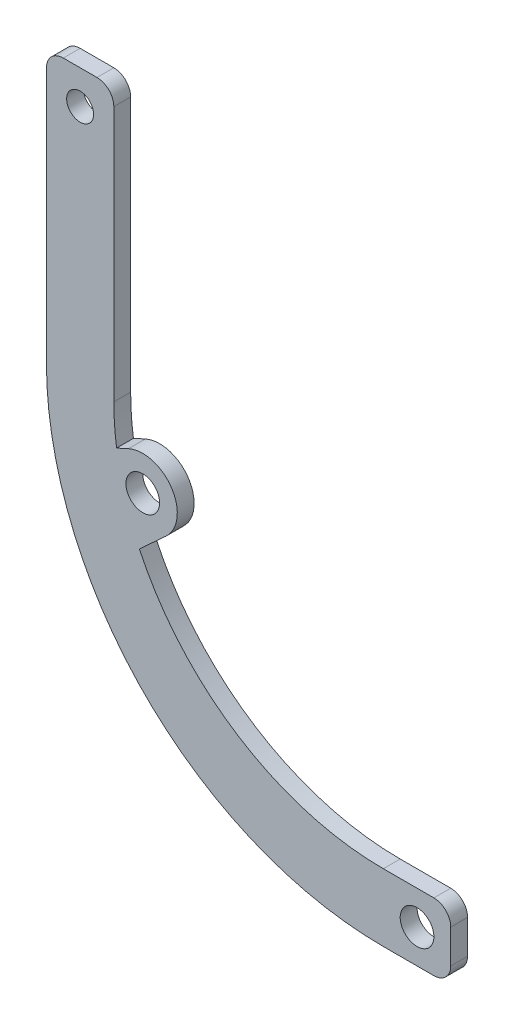
ISO-10303-21;
HEADER;
FILE_DESCRIPTION(('STEP AP214'),'2;1');
FILE_NAME('part.step','',(''),(''),'','','');
FILE_SCHEMA(('AUTOMOTIVE_DESIGN { 1 0 10303 214 1 1 1 1 }'));
ENDSEC;
DATA;
#1=APPLICATION_CONTEXT('core data for automotive mechanical design processes');
#2=APPLICATION_PROTOCOL_DEFINITION('international standard','automotive_design',2000,#1);
#3=PRODUCT_CONTEXT('',#1,'mechanical');
#4=PRODUCT('Part','Part','',(#3));
#5=PRODUCT_RELATED_PRODUCT_CATEGORY('part','',(#4));
#6=PRODUCT_DEFINITION_FORMATION('','',#4);
#7=PRODUCT_DEFINITION_CONTEXT('part definition',#1,'design');
#8=PRODUCT_DEFINITION('design','',#6,#7);
#9=PRODUCT_DEFINITION_SHAPE('','',#8);
#10=(LENGTH_UNIT() NAMED_UNIT(*) SI_UNIT(.MILLI.,.METRE.));
#11=(NAMED_UNIT(*) PLANE_ANGLE_UNIT() SI_UNIT($,.RADIAN.));
#12=(NAMED_UNIT(*) SI_UNIT($,.STERADIAN.) SOLID_ANGLE_UNIT());
#13=UNCERTAINTY_MEASURE_WITH_UNIT(LENGTH_MEASURE(1.E-05),#10,'distance_accuracy_value','');
#14=(GEOMETRIC_REPRESENTATION_CONTEXT(3) GLOBAL_UNCERTAINTY_ASSIGNED_CONTEXT((#13)) GLOBAL_UNIT_ASSIGNED_CONTEXT((#10,
#11,#12)) REPRESENTATION_CONTEXT('',''));
#15=CARTESIAN_POINT('',(0.,0.,0.));
#16=DIRECTION('',(0.,0.,1.));
#17=DIRECTION('',(1.,0.,0.));
#18=AXIS2_PLACEMENT_3D('',#15,#16,#17);
#19=CARTESIAN_POINT('',(-10.,90.,5.));
#20=DIRECTION('',(0.,0.,1.));
#21=DIRECTION('',(1.,0.,0.));
#22=AXIS2_PLACEMENT_3D('',#19,#20,#21);
#23=PLANE('',#22);
#24=CARTESIAN_POINT('',(-100.,160.890270730837,5.));
#25=DIRECTION('',(0.,0.,1.));
#26=DIRECTION('',(1.,0.,0.));
#27=AXIS2_PLACEMENT_3D('',#24,#25,#26);
#28=CIRCLE('',#27,4.00000000000001);
#29=CARTESIAN_POINT('',(-96.,160.890270730837,5.));
#30=VERTEX_POINT('',#29);
#31=EDGE_CURVE('E312',#30,#30,#28,.T.);
#32=ORIENTED_EDGE('',*,*,#31,.F.);
#33=EDGE_LOOP('',(#32));
#34=FACE_BOUND('',#33,.T.);
#35=DIRECTION('',(1.,0.,0.));
#36=VECTOR('',#35,1.);
#37=CARTESIAN_POINT('',(10.,-10.,5.));
#38=LINE('',#37,#36);
#39=CARTESIAN_POINT('',(-10.,-10.,5.));
#40=VERTEX_POINT('',#39);
#41=CARTESIAN_POINT('',(5.,-10.,5.));
#42=VERTEX_POINT('',#41);
#43=EDGE_CURVE('E194',#40,#42,#38,.T.);
#44=ORIENTED_EDGE('',*,*,#43,.T.);
#45=CARTESIAN_POINT('',(5.,-5.,5.));
#46=DIRECTION('',(0.,0.,1.));
#47=DIRECTION('',(1.,0.,0.));
#48=AXIS2_PLACEMENT_3D('',#45,#46,#47);
#49=CIRCLE('',#48,5.);
#50=CARTESIAN_POINT('',(10.,-5.,5.));
#51=VERTEX_POINT('',#50);
#52=EDGE_CURVE('E260',#42,#51,#49,.T.);
#53=ORIENTED_EDGE('',*,*,#52,.T.);
#54=DIRECTION('',(0.,1.,0.));
#55=VECTOR('',#54,1.);
#56=CARTESIAN_POINT('',(10.,10.,5.));
#57=LINE('',#56,#55);
#58=CARTESIAN_POINT('',(10.,5.,5.));
#59=VERTEX_POINT('',#58);
#60=EDGE_CURVE('E159',#51,#59,#57,.T.);
#61=ORIENTED_EDGE('',*,*,#60,.T.);
#62=CARTESIAN_POINT('',(5.,5.,5.));
#63=DIRECTION('',(0.,0.,1.));
#64=DIRECTION('',(1.,0.,0.));
#65=AXIS2_PLACEMENT_3D('',#62,#63,#64);
#66=CIRCLE('',#65,5.);
#67=CARTESIAN_POINT('',(5.,10.,5.));
#68=VERTEX_POINT('',#67);
#69=EDGE_CURVE('E155',#59,#68,#66,.T.);
#70=ORIENTED_EDGE('',*,*,#69,.T.);
#71=DIRECTION('',(-1.,0.,0.));
#72=VECTOR('',#71,1.);
#73=CARTESIAN_POINT('',(-10.,10.,5.));
#74=LINE('',#73,#72);
#75=CARTESIAN_POINT('',(-10.,10.,5.));
#76=VERTEX_POINT('',#75);
#77=EDGE_CURVE('E146',#68,#76,#74,.T.);
#78=ORIENTED_EDGE('',*,*,#77,.T.);
#79=CARTESIAN_POINT('',(-9.99999999999994,90.0000000000002,5.));
#80=DIRECTION('',(0.,0.,-1.));
#81=DIRECTION('',(1.,0.,0.));
#82=AXIS2_PLACEMENT_3D('',#79,#80,#81);
#83=CIRCLE('',#82,80.0000000000001);
#84=CARTESIAN_POINT('',(-82.4127851454922,55.9942865466289,5.));
#85=VERTEX_POINT('',#84);
#86=EDGE_CURVE('E151',#76,#85,#83,.T.);
#87=ORIENTED_EDGE('',*,*,#86,.T.);
#88=DIRECTION('',(0.737262854760369,0.675606011659599,0.));
#89=VECTOR('',#88,1.);
#90=CARTESIAN_POINT('',(-82.4127851454922,55.9942865466289,5.));
#91=LINE('',#90,#89);
#92=CARTESIAN_POINT('',(-74.4832753069822,63.2606563112532,5.));
#93=VERTEX_POINT('',#92);
#94=EDGE_CURVE('E174',#85,#93,#91,.T.);
#95=ORIENTED_EDGE('',*,*,#94,.T.);
#96=CARTESIAN_POINT('',(-81.4071488131176,70.8164131562724,5.));
#97=DIRECTION('',(0.,0.,1.));
#98=DIRECTION('',(-1.,0.,0.));
#99=AXIS2_PLACEMENT_3D('',#96,#97,#98);
#100=CIRCLE('',#99,10.2483894261498);
#101=CARTESIAN_POINT('',(-85.6506966603431,80.1449600687517,5.));
#102=VERTEX_POINT('',#101);
#103=EDGE_CURVE('E176',#93,#102,#100,.T.);
#104=ORIENTED_EDGE('',*,*,#103,.T.);
#105=DIRECTION('',(-0.910245163857318,-0.414069730449311,0.));
#106=VECTOR('',#105,1.);
#107=CARTESIAN_POINT('',(-89.1751662279007,78.5416819391201,5.));
#108=LINE('',#107,#106);
#109=CARTESIAN_POINT('',(-89.1751662279007,78.5416819391201,5.));
#110=VERTEX_POINT('',#109);
#111=EDGE_CURVE('E181',#102,#110,#108,.T.);
#112=ORIENTED_EDGE('',*,*,#111,.T.);
#113=CARTESIAN_POINT('',(-9.99999999999994,90.0000000000002,5.));
#114=DIRECTION('',(0.,0.,-1.));
#115=DIRECTION('',(1.,0.,0.));
#116=AXIS2_PLACEMENT_3D('',#113,#114,#115);
#117=CIRCLE('',#116,80.);
#118=CARTESIAN_POINT('',(-90.,90.,5.));
#119=VERTEX_POINT('',#118);
#120=EDGE_CURVE('E183',#110,#119,#117,.T.);
#121=ORIENTED_EDGE('',*,*,#120,.T.);
#122=DIRECTION('',(0.,1.,0.));
#123=VECTOR('',#122,1.);
#124=CARTESIAN_POINT('',(-90.,170.890270730837,5.));
#125=LINE('',#124,#123);
#126=CARTESIAN_POINT('',(-90.,165.890270730837,5.));
#127=VERTEX_POINT('',#126);
#128=EDGE_CURVE('E185',#119,#127,#125,.T.);
#129=ORIENTED_EDGE('',*,*,#128,.T.);
#130=CARTESIAN_POINT('',(-95.,165.890270730837,5.));
#131=DIRECTION('',(0.,0.,1.));
#132=DIRECTION('',(1.,0.,0.));
#133=AXIS2_PLACEMENT_3D('',#130,#131,#132);
#134=CIRCLE('',#133,5.);
#135=CARTESIAN_POINT('',(-95.,170.890270730837,5.));
#136=VERTEX_POINT('',#135);
#137=EDGE_CURVE('E257',#127,#136,#134,.T.);
#138=ORIENTED_EDGE('',*,*,#137,.T.);
#139=DIRECTION('',(-1.,0.,0.));
#140=VECTOR('',#139,1.);
#141=CARTESIAN_POINT('',(-110.,170.890270730837,5.));
#142=LINE('',#141,#140);
#143=CARTESIAN_POINT('',(-105.,170.890270730837,5.));
#144=VERTEX_POINT('',#143);
#145=EDGE_CURVE('E188',#136,#144,#142,.T.);
#146=ORIENTED_EDGE('',*,*,#145,.T.);
#147=CARTESIAN_POINT('',(-105.,165.890270730837,5.));
#148=DIRECTION('',(0.,0.,1.));
#149=DIRECTION('',(1.,0.,0.));
#150=AXIS2_PLACEMENT_3D('',#147,#148,#149);
#151=CIRCLE('',#150,5.);
#152=CARTESIAN_POINT('',(-110.,165.890270730837,5.));
#153=VERTEX_POINT('',#152);
#154=EDGE_CURVE('E48',#144,#153,#151,.T.);
#155=ORIENTED_EDGE('',*,*,#154,.T.);
#156=DIRECTION('',(0.,-1.,0.));
#157=VECTOR('',#156,1.);
#158=CARTESIAN_POINT('',(-110.,90.,5.));
#159=LINE('',#158,#157);
#160=CARTESIAN_POINT('',(-110.,90.,5.));
#161=VERTEX_POINT('',#160);
#162=EDGE_CURVE('E190',#153,#161,#159,.T.);
#163=ORIENTED_EDGE('',*,*,#162,.T.);
#164=CARTESIAN_POINT('',(-10.,90.,5.));
#165=DIRECTION('',(0.,0.,1.));
#166=DIRECTION('',(1.,0.,0.));
#167=AXIS2_PLACEMENT_3D('',#164,#165,#166);
#168=CIRCLE('',#167,100.);
#169=EDGE_CURVE('E192',#161,#40,#168,.T.);
#170=ORIENTED_EDGE('',*,*,#169,.T.);
#171=EDGE_LOOP('',(#44,#53,#61,#70,#78,#87,#95,#104,#112,#121,#129,#138,#146,#155,#163,#170));
#172=FACE_BOUND('',#171,.T.);
#173=CARTESIAN_POINT('',(0.,0.,5.));
#174=DIRECTION('',(0.,0.,1.));
#175=DIRECTION('',(1.,0.,0.));
#176=AXIS2_PLACEMENT_3D('',#173,#174,#175);
#177=CIRCLE('',#176,5.);
#178=CARTESIAN_POINT('',(5.,0.,5.));
#179=VERTEX_POINT('',#178);
#180=EDGE_CURVE('E200',#179,#179,#177,.T.);
#181=ORIENTED_EDGE('',*,*,#180,.F.);
#182=EDGE_LOOP('',(#181));
#183=FACE_BOUND('',#182,.T.);
#184=CARTESIAN_POINT('',(-81.4071488131176,70.8164131562724,5.));
#185=DIRECTION('',(0.,0.,1.));
#186=DIRECTION('',(1.,0.,0.));
#187=AXIS2_PLACEMENT_3D('',#184,#185,#186);
#188=CIRCLE('',#187,5.00000000000001);
#189=CARTESIAN_POINT('',(-76.4071488131176,70.8164131562724,5.));
#190=VERTEX_POINT('',#189);
#191=EDGE_CURVE('E318',#190,#190,#188,.T.);
#192=ORIENTED_EDGE('',*,*,#191,.F.);
#193=EDGE_LOOP('',(#192));
#194=FACE_BOUND('',#193,.T.);
#195=ADVANCED_FACE('F33',(#34,#172,#183,#194),#23,.T.);
#196=CARTESIAN_POINT('',(-10.,90.,0.));
#197=DIRECTION('',(0.,0.,1.));
#198=DIRECTION('',(1.,0.,0.));
#199=AXIS2_PLACEMENT_3D('',#196,#197,#198);
#200=PLANE('',#199);
#201=DIRECTION('',(0.,1.,0.));
#202=VECTOR('',#201,1.);
#203=CARTESIAN_POINT('',(10.,10.,0.));
#204=LINE('',#203,#202);
#205=CARTESIAN_POINT('',(10.,-5.,0.));
#206=VERTEX_POINT('',#205);
#207=CARTESIAN_POINT('',(10.,5.,0.));
#208=VERTEX_POINT('',#207);
#209=EDGE_CURVE('E197',#206,#208,#204,.T.);
#210=ORIENTED_EDGE('',*,*,#209,.F.);
#211=CARTESIAN_POINT('',(5.,-5.,0.));
#212=DIRECTION('',(0.,0.,1.));
#213=DIRECTION('',(1.,0.,0.));
#214=AXIS2_PLACEMENT_3D('',#211,#212,#213);
#215=CIRCLE('',#214,5.);
#216=CARTESIAN_POINT('',(5.,-10.,0.));
#217=VERTEX_POINT('',#216);
#218=EDGE_CURVE('E252',#206,#217,#215,.F.);
#219=ORIENTED_EDGE('',*,*,#218,.T.);
#220=DIRECTION('',(1.,0.,0.));
#221=VECTOR('',#220,1.);
#222=CARTESIAN_POINT('',(10.,-10.,0.));
#223=LINE('',#222,#221);
#224=CARTESIAN_POINT('',(-10.,-10.,0.));
#225=VERTEX_POINT('',#224);
#226=EDGE_CURVE('E221',#225,#217,#223,.T.);
#227=ORIENTED_EDGE('',*,*,#226,.F.);
#228=CARTESIAN_POINT('',(-10.,90.,0.));
#229=DIRECTION('',(0.,0.,1.));
#230=DIRECTION('',(1.,0.,0.));
#231=AXIS2_PLACEMENT_3D('',#228,#229,#230);
#232=CIRCLE('',#231,100.);
#233=CARTESIAN_POINT('',(-110.,90.,0.));
#234=VERTEX_POINT('',#233);
#235=EDGE_CURVE('E219',#234,#225,#232,.T.);
#236=ORIENTED_EDGE('',*,*,#235,.F.);
#237=DIRECTION('',(0.,-1.,0.));
#238=VECTOR('',#237,1.);
#239=CARTESIAN_POINT('',(-110.,90.,0.));
#240=LINE('',#239,#238);
#241=CARTESIAN_POINT('',(-110.,165.890270730837,0.));
#242=VERTEX_POINT('',#241);
#243=EDGE_CURVE('E217',#242,#234,#240,.T.);
#244=ORIENTED_EDGE('',*,*,#243,.F.);
#245=CARTESIAN_POINT('',(-105.,165.890270730837,0.));
#246=DIRECTION('',(0.,0.,1.));
#247=DIRECTION('',(1.,0.,0.));
#248=AXIS2_PLACEMENT_3D('',#245,#246,#247);
#249=CIRCLE('',#248,5.);
#250=CARTESIAN_POINT('',(-105.,170.890270730837,0.));
#251=VERTEX_POINT('',#250);
#252=EDGE_CURVE('E246',#242,#251,#249,.F.);
#253=ORIENTED_EDGE('',*,*,#252,.T.);
#254=DIRECTION('',(-1.,0.,0.));
#255=VECTOR('',#254,1.);
#256=CARTESIAN_POINT('',(-110.,170.890270730837,0.));
#257=LINE('',#256,#255);
#258=CARTESIAN_POINT('',(-95.,170.890270730837,0.));
#259=VERTEX_POINT('',#258);
#260=EDGE_CURVE('E215',#259,#251,#257,.T.);
#261=ORIENTED_EDGE('',*,*,#260,.F.);
#262=CARTESIAN_POINT('',(-95.,165.890270730837,0.));
#263=DIRECTION('',(0.,0.,1.));
#264=DIRECTION('',(1.,0.,0.));
#265=AXIS2_PLACEMENT_3D('',#262,#263,#264);
#266=CIRCLE('',#265,5.);
#267=CARTESIAN_POINT('',(-90.,165.890270730837,0.));
#268=VERTEX_POINT('',#267);
#269=EDGE_CURVE('E248',#259,#268,#266,.F.);
#270=ORIENTED_EDGE('',*,*,#269,.T.);
#271=DIRECTION('',(0.,1.,0.));
#272=VECTOR('',#271,1.);
#273=CARTESIAN_POINT('',(-90.,170.890270730837,0.));
#274=LINE('',#273,#272);
#275=CARTESIAN_POINT('',(-90.,90.,0.));
#276=VERTEX_POINT('',#275);
#277=EDGE_CURVE('E212',#276,#268,#274,.T.);
#278=ORIENTED_EDGE('',*,*,#277,.F.);
#279=CARTESIAN_POINT('',(-9.99999999999994,90.0000000000002,0.));
#280=DIRECTION('',(0.,0.,-1.));
#281=DIRECTION('',(1.,0.,0.));
#282=AXIS2_PLACEMENT_3D('',#279,#280,#281);
#283=CIRCLE('',#282,80.);
#284=CARTESIAN_POINT('',(-89.1751662279007,78.5416819391201,0.));
#285=VERTEX_POINT('',#284);
#286=EDGE_CURVE('E210',#285,#276,#283,.T.);
#287=ORIENTED_EDGE('',*,*,#286,.F.);
#288=DIRECTION('',(-0.910245163857318,-0.414069730449311,0.));
#289=VECTOR('',#288,1.);
#290=CARTESIAN_POINT('',(-89.1751662279007,78.5416819391201,0.));
#291=LINE('',#290,#289);
#292=CARTESIAN_POINT('',(-85.6506966603431,80.1449600687517,0.));
#293=VERTEX_POINT('',#292);
#294=EDGE_CURVE('E208',#293,#285,#291,.T.);
#295=ORIENTED_EDGE('',*,*,#294,.F.);
#296=CARTESIAN_POINT('',(-81.4071488131176,70.8164131562724,0.));
#297=DIRECTION('',(0.,0.,1.));
#298=DIRECTION('',(-1.,0.,0.));
#299=AXIS2_PLACEMENT_3D('',#296,#297,#298);
#300=CIRCLE('',#299,10.2483894261498);
#301=CARTESIAN_POINT('',(-74.4832753069822,63.2606563112532,0.));
#302=VERTEX_POINT('',#301);
#303=EDGE_CURVE('E206',#302,#293,#300,.T.);
#304=ORIENTED_EDGE('',*,*,#303,.F.);
#305=DIRECTION('',(0.737262854760369,0.675606011659599,0.));
#306=VECTOR('',#305,1.);
#307=CARTESIAN_POINT('',(-82.4127851454922,55.9942865466289,0.));
#308=LINE('',#307,#306);
#309=CARTESIAN_POINT('',(-82.4127851454922,55.9942865466289,0.));
#310=VERTEX_POINT('',#309);
#311=EDGE_CURVE('E204',#310,#302,#308,.T.);
#312=ORIENTED_EDGE('',*,*,#311,.F.);
#313=CARTESIAN_POINT('',(-9.99999999999994,90.0000000000002,0.));
#314=DIRECTION('',(0.,0.,-1.));
#315=DIRECTION('',(1.,0.,0.));
#316=AXIS2_PLACEMENT_3D('',#313,#314,#315);
#317=CIRCLE('',#316,80.0000000000001);
#318=CARTESIAN_POINT('',(-10.,10.,0.));
#319=VERTEX_POINT('',#318);
#320=EDGE_CURVE('E202',#319,#310,#317,.T.);
#321=ORIENTED_EDGE('',*,*,#320,.F.);
#322=DIRECTION('',(-1.,0.,0.));
#323=VECTOR('',#322,1.);
#324=CARTESIAN_POINT('',(-10.,10.,0.));
#325=LINE('',#324,#323);
#326=CARTESIAN_POINT('',(5.,10.,0.));
#327=VERTEX_POINT('',#326);
#328=EDGE_CURVE('E165',#327,#319,#325,.T.);
#329=ORIENTED_EDGE('',*,*,#328,.F.);
#330=CARTESIAN_POINT('',(5.,5.,0.));
#331=DIRECTION('',(0.,0.,1.));
#332=DIRECTION('',(1.,0.,0.));
#333=AXIS2_PLACEMENT_3D('',#330,#331,#332);
#334=CIRCLE('',#333,5.);
#335=EDGE_CURVE('E250',#327,#208,#334,.F.);
#336=ORIENTED_EDGE('',*,*,#335,.T.);
#337=EDGE_LOOP('',(#210,#219,#227,#236,#244,#253,#261,#270,#278,#287,#295,#304,#312,#321,#329,#336));
#338=FACE_BOUND('',#337,.T.);
#339=CARTESIAN_POINT('',(0.,0.,0.));
#340=DIRECTION('',(0.,0.,1.));
#341=DIRECTION('',(1.,0.,0.));
#342=AXIS2_PLACEMENT_3D('',#339,#340,#341);
#343=CIRCLE('',#342,5.);
#344=CARTESIAN_POINT('',(5.,0.,0.));
#345=VERTEX_POINT('',#344);
#346=EDGE_CURVE('E309',#345,#345,#343,.T.);
#347=ORIENTED_EDGE('',*,*,#346,.T.);
#348=EDGE_LOOP('',(#347));
#349=FACE_BOUND('',#348,.T.);
#350=CARTESIAN_POINT('',(-100.,160.890270730837,0.));
#351=DIRECTION('',(0.,0.,1.));
#352=DIRECTION('',(1.,0.,0.));
#353=AXIS2_PLACEMENT_3D('',#350,#351,#352);
#354=CIRCLE('',#353,4.00000000000001);
#355=CARTESIAN_POINT('',(-96.,160.890270730837,0.));
#356=VERTEX_POINT('',#355);
#357=EDGE_CURVE('E315',#356,#356,#354,.T.);
#358=ORIENTED_EDGE('',*,*,#357,.T.);
#359=EDGE_LOOP('',(#358));
#360=FACE_BOUND('',#359,.T.);
#361=CARTESIAN_POINT('',(-81.4071488131176,70.8164131562724,0.));
#362=DIRECTION('',(0.,0.,1.));
#363=DIRECTION('',(1.,0.,0.));
#364=AXIS2_PLACEMENT_3D('',#361,#362,#363);
#365=CIRCLE('',#364,5.00000000000001);
#366=CARTESIAN_POINT('',(-76.4071488131176,70.8164131562724,0.));
#367=VERTEX_POINT('',#366);
#368=EDGE_CURVE('E321',#367,#367,#365,.T.);
#369=ORIENTED_EDGE('',*,*,#368,.T.);
#370=EDGE_LOOP('',(#369));
#371=FACE_BOUND('',#370,.T.);
#372=ADVANCED_FACE('F282',(#338,#349,#360,#371),#200,.F.);
#373=CARTESIAN_POINT('',(10.,10.,5.));
#374=DIRECTION('',(-1.,0.,0.));
#375=DIRECTION('',(0.,0.,1.));
#376=AXIS2_PLACEMENT_3D('',#373,#374,#375);
#377=PLANE('',#376);
#378=ORIENTED_EDGE('',*,*,#60,.F.);
#379=DIRECTION('',(0.,0.,-1.));
#380=VECTOR('',#379,1.);
#381=CARTESIAN_POINT('',(10.,-5.,5.));
#382=LINE('',#381,#380);
#383=EDGE_CURVE('E243',#51,#206,#382,.T.);
#384=ORIENTED_EDGE('',*,*,#383,.T.);
#385=ORIENTED_EDGE('',*,*,#209,.T.);
#386=DIRECTION('',(0.,0.,-1.));
#387=VECTOR('',#386,1.);
#388=CARTESIAN_POINT('',(10.,5.,5.));
#389=LINE('',#388,#387);
#390=EDGE_CURVE('E168',#208,#59,#389,.F.);
#391=ORIENTED_EDGE('',*,*,#390,.T.);
#392=EDGE_LOOP('',(#378,#384,#385,#391));
#393=FACE_BOUND('',#392,.T.);
#394=ADVANCED_FACE('F306',(#393),#377,.F.);
#395=CARTESIAN_POINT('',(-10.,10.,5.));
#396=DIRECTION('',(0.,-1.,0.));
#397=DIRECTION('',(1.,0.,0.));
#398=AXIS2_PLACEMENT_3D('',#395,#396,#397);
#399=PLANE('',#398);
#400=ORIENTED_EDGE('',*,*,#77,.F.);
#401=DIRECTION('',(0.,0.,-1.));
#402=VECTOR('',#401,1.);
#403=CARTESIAN_POINT('',(5.,10.,5.));
#404=LINE('',#403,#402);
#405=EDGE_CURVE('E262',#68,#327,#404,.T.);
#406=ORIENTED_EDGE('',*,*,#405,.T.);
#407=ORIENTED_EDGE('',*,*,#328,.T.);
#408=DIRECTION('',(0.,0.,-1.));
#409=VECTOR('',#408,1.);
#410=CARTESIAN_POINT('',(-10.,10.,5.));
#411=LINE('',#410,#409);
#412=EDGE_CURVE('E162',#76,#319,#411,.T.);
#413=ORIENTED_EDGE('',*,*,#412,.F.);
#414=EDGE_LOOP('',(#400,#406,#407,#413));
#415=FACE_BOUND('',#414,.T.);
#416=ADVANCED_FACE('F163',(#415),#399,.F.);
#417=CARTESIAN_POINT('',(-9.99999999999994,90.0000000000002,5.));
#418=DIRECTION('',(0.,0.,-1.));
#419=DIRECTION('',(-1.,0.,0.));
#420=AXIS2_PLACEMENT_3D('',#417,#418,#419);
#421=CYLINDRICAL_SURFACE('',#420,80.0000000000001);
#422=ORIENTED_EDGE('',*,*,#320,.T.);
#423=DIRECTION('',(0.,0.,-1.));
#424=VECTOR('',#423,1.);
#425=CARTESIAN_POINT('',(-82.4127851454922,55.9942865466289,5.));
#426=LINE('',#425,#424);
#427=EDGE_CURVE('E169',#85,#310,#426,.T.);
#428=ORIENTED_EDGE('',*,*,#427,.F.);
#429=ORIENTED_EDGE('',*,*,#86,.F.);
#430=ORIENTED_EDGE('',*,*,#412,.T.);
#431=EDGE_LOOP('',(#422,#428,#429,#430));
#432=FACE_BOUND('',#431,.T.);
#433=ADVANCED_FACE('F171',(#432),#421,.F.);
#434=CARTESIAN_POINT('',(-82.4127851454922,55.9942865466289,5.));
#435=DIRECTION('',(-0.6756060116596,0.737262854760369,0.));
#436=DIRECTION('',(-0.737262854760369,-0.6756060116596,0.));
#437=AXIS2_PLACEMENT_3D('',#434,#435,#436);
#438=PLANE('',#437);
#439=ORIENTED_EDGE('',*,*,#311,.T.);
#440=DIRECTION('',(0.,0.,-1.));
#441=VECTOR('',#440,1.);
#442=CARTESIAN_POINT('',(-74.4832753069822,63.2606563112532,5.));
#443=LINE('',#442,#441);
#444=EDGE_CURVE('E238',#93,#302,#443,.T.);
#445=ORIENTED_EDGE('',*,*,#444,.F.);
#446=ORIENTED_EDGE('',*,*,#94,.F.);
#447=ORIENTED_EDGE('',*,*,#427,.T.);
#448=EDGE_LOOP('',(#439,#445,#446,#447));
#449=FACE_BOUND('',#448,.T.);
#450=ADVANCED_FACE('F363',(#449),#438,.F.);
#451=CARTESIAN_POINT('',(-81.4071488131176,70.8164131562724,5.));
#452=DIRECTION('',(0.,0.,-1.));
#453=DIRECTION('',(-1.,0.,0.));
#454=AXIS2_PLACEMENT_3D('',#451,#452,#453);
#455=CYLINDRICAL_SURFACE('',#454,10.2483894261498);
#456=ORIENTED_EDGE('',*,*,#303,.T.);
#457=DIRECTION('',(0.,0.,-1.));
#458=VECTOR('',#457,1.);
#459=CARTESIAN_POINT('',(-85.6506966603431,80.1449600687517,5.));
#460=LINE('',#459,#458);
#461=EDGE_CURVE('E235',#102,#293,#460,.T.);
#462=ORIENTED_EDGE('',*,*,#461,.F.);
#463=ORIENTED_EDGE('',*,*,#103,.F.);
#464=ORIENTED_EDGE('',*,*,#444,.T.);
#465=EDGE_LOOP('',(#456,#462,#463,#464));
#466=FACE_BOUND('',#465,.T.);
#467=ADVANCED_FACE('F359',(#466),#455,.T.);
#468=CARTESIAN_POINT('',(-89.1751662279007,78.5416819391201,5.));
#469=DIRECTION('',(0.414069730449311,-0.910245163857318,0.));
#470=DIRECTION('',(0.910245163857318,0.414069730449311,0.));
#471=AXIS2_PLACEMENT_3D('',#468,#469,#470);
#472=PLANE('',#471);
#473=ORIENTED_EDGE('',*,*,#294,.T.);
#474=DIRECTION('',(0.,0.,-1.));
#475=VECTOR('',#474,1.);
#476=CARTESIAN_POINT('',(-89.1751662279007,78.5416819391201,5.));
#477=LINE('',#476,#475);
#478=EDGE_CURVE('E232',#110,#285,#477,.T.);
#479=ORIENTED_EDGE('',*,*,#478,.F.);
#480=ORIENTED_EDGE('',*,*,#111,.F.);
#481=ORIENTED_EDGE('',*,*,#461,.T.);
#482=EDGE_LOOP('',(#473,#479,#480,#481));
#483=FACE_BOUND('',#482,.T.);
#484=ADVANCED_FACE('F355',(#483),#472,.F.);
#485=CARTESIAN_POINT('',(-9.99999999999994,90.0000000000002,5.));
#486=DIRECTION('',(0.,0.,-1.));
#487=DIRECTION('',(-1.,0.,0.));
#488=AXIS2_PLACEMENT_3D('',#485,#486,#487);
#489=CYLINDRICAL_SURFACE('',#488,80.);
#490=ORIENTED_EDGE('',*,*,#286,.T.);
#491=DIRECTION('',(0.,0.,-1.));
#492=VECTOR('',#491,1.);
#493=CARTESIAN_POINT('',(-90.,90.,5.));
#494=LINE('',#493,#492);
#495=EDGE_CURVE('E229',#119,#276,#494,.T.);
#496=ORIENTED_EDGE('',*,*,#495,.F.);
#497=ORIENTED_EDGE('',*,*,#120,.F.);
#498=ORIENTED_EDGE('',*,*,#478,.T.);
#499=EDGE_LOOP('',(#490,#496,#497,#498));
#500=FACE_BOUND('',#499,.T.);
#501=ADVANCED_FACE('F352',(#500),#489,.F.);
#502=CARTESIAN_POINT('',(-90.,170.890270730837,5.));
#503=DIRECTION('',(-1.,0.,0.));
#504=DIRECTION('',(0.,-1.,0.));
#505=AXIS2_PLACEMENT_3D('',#502,#503,#504);
#506=PLANE('',#505);
#507=ORIENTED_EDGE('',*,*,#277,.T.);
#508=DIRECTION('',(0.,0.,-1.));
#509=VECTOR('',#508,1.);
#510=CARTESIAN_POINT('',(-90.,165.890270730837,5.));
#511=LINE('',#510,#509);
#512=EDGE_CURVE('E41',#268,#127,#511,.F.);
#513=ORIENTED_EDGE('',*,*,#512,.T.);
#514=ORIENTED_EDGE('',*,*,#128,.F.);
#515=ORIENTED_EDGE('',*,*,#495,.T.);
#516=EDGE_LOOP('',(#507,#513,#514,#515));
#517=FACE_BOUND('',#516,.T.);
#518=ADVANCED_FACE('F270',(#517),#506,.F.);
#519=CARTESIAN_POINT('',(-110.,170.890270730837,5.));
#520=DIRECTION('',(0.,-1.,0.));
#521=DIRECTION('',(0.,0.,-1.));
#522=AXIS2_PLACEMENT_3D('',#519,#520,#521);
#523=PLANE('',#522);
#524=ORIENTED_EDGE('',*,*,#145,.F.);
#525=DIRECTION('',(0.,0.,-1.));
#526=VECTOR('',#525,1.);
#527=CARTESIAN_POINT('',(-95.,170.890270730837,5.));
#528=LINE('',#527,#526);
#529=EDGE_CURVE('E265',#136,#259,#528,.T.);
#530=ORIENTED_EDGE('',*,*,#529,.T.);
#531=ORIENTED_EDGE('',*,*,#260,.T.);
#532=DIRECTION('',(0.,0.,-1.));
#533=VECTOR('',#532,1.);
#534=CARTESIAN_POINT('',(-105.,170.890270730837,5.));
#535=LINE('',#534,#533);
#536=EDGE_CURVE('E56',#251,#144,#535,.F.);
#537=ORIENTED_EDGE('',*,*,#536,.T.);
#538=EDGE_LOOP('',(#524,#530,#531,#537));
#539=FACE_BOUND('',#538,.T.);
#540=ADVANCED_FACE('F279',(#539),#523,.F.);
#541=CARTESIAN_POINT('',(-110.,90.,5.));
#542=DIRECTION('',(1.,0.,0.));
#543=DIRECTION('',(0.,0.,-1.));
#544=AXIS2_PLACEMENT_3D('',#541,#542,#543);
#545=PLANE('',#544);
#546=ORIENTED_EDGE('',*,*,#162,.F.);
#547=DIRECTION('',(0.,0.,-1.));
#548=VECTOR('',#547,1.);
#549=CARTESIAN_POINT('',(-110.,165.890270730837,5.));
#550=LINE('',#549,#548);
#551=EDGE_CURVE('E11',#153,#242,#550,.T.);
#552=ORIENTED_EDGE('',*,*,#551,.T.);
#553=ORIENTED_EDGE('',*,*,#243,.T.);
#554=DIRECTION('',(0.,0.,-1.));
#555=VECTOR('',#554,1.);
#556=CARTESIAN_POINT('',(-110.,90.,5.));
#557=LINE('',#556,#555);
#558=EDGE_CURVE('E226',#161,#234,#557,.T.);
#559=ORIENTED_EDGE('',*,*,#558,.F.);
#560=EDGE_LOOP('',(#546,#552,#553,#559));
#561=FACE_BOUND('',#560,.T.);
#562=ADVANCED_FACE('F289',(#561),#545,.F.);
#563=CARTESIAN_POINT('',(-10.,90.,5.));
#564=DIRECTION('',(0.,0.,-1.));
#565=DIRECTION('',(-1.,0.,0.));
#566=AXIS2_PLACEMENT_3D('',#563,#564,#565);
#567=CYLINDRICAL_SURFACE('',#566,100.);
#568=ORIENTED_EDGE('',*,*,#235,.T.);
#569=DIRECTION('',(0.,0.,-1.));
#570=VECTOR('',#569,1.);
#571=CARTESIAN_POINT('',(-10.,-10.,5.));
#572=LINE('',#571,#570);
#573=EDGE_CURVE('E196',#40,#225,#572,.T.);
#574=ORIENTED_EDGE('',*,*,#573,.F.);
#575=ORIENTED_EDGE('',*,*,#169,.F.);
#576=ORIENTED_EDGE('',*,*,#558,.T.);
#577=EDGE_LOOP('',(#568,#574,#575,#576));
#578=FACE_BOUND('',#577,.T.);
#579=ADVANCED_FACE('F296',(#578),#567,.T.);
#580=CARTESIAN_POINT('',(10.,-10.,5.));
#581=DIRECTION('',(0.,1.,0.));
#582=DIRECTION('',(-1.,0.,0.));
#583=AXIS2_PLACEMENT_3D('',#580,#581,#582);
#584=PLANE('',#583);
#585=ORIENTED_EDGE('',*,*,#226,.T.);
#586=DIRECTION('',(0.,0.,-1.));
#587=VECTOR('',#586,1.);
#588=CARTESIAN_POINT('',(5.,-10.,5.));
#589=LINE('',#588,#587);
#590=EDGE_CURVE('E254',#217,#42,#589,.F.);
#591=ORIENTED_EDGE('',*,*,#590,.T.);
#592=ORIENTED_EDGE('',*,*,#43,.F.);
#593=ORIENTED_EDGE('',*,*,#573,.T.);
#594=EDGE_LOOP('',(#585,#591,#592,#593));
#595=FACE_BOUND('',#594,.T.);
#596=ADVANCED_FACE('F299',(#595),#584,.F.);
#597=CARTESIAN_POINT('',(0.,0.,5.));
#598=DIRECTION('',(0.,0.,-1.));
#599=DIRECTION('',(-1.,0.,0.));
#600=AXIS2_PLACEMENT_3D('',#597,#598,#599);
#601=CYLINDRICAL_SURFACE('',#600,5.);
#602=ORIENTED_EDGE('',*,*,#180,.T.);
#603=EDGE_LOOP('',(#602));
#604=FACE_BOUND('',#603,.T.);
#605=ORIENTED_EDGE('',*,*,#346,.F.);
#606=EDGE_LOOP('',(#605));
#607=FACE_BOUND('',#606,.T.);
#608=ADVANCED_FACE('F339',(#604,#607),#601,.F.);
#609=CARTESIAN_POINT('',(-100.,160.890270730837,5.));
#610=DIRECTION('',(0.,0.,-1.));
#611=DIRECTION('',(-1.,0.,0.));
#612=AXIS2_PLACEMENT_3D('',#609,#610,#611);
#613=CYLINDRICAL_SURFACE('',#612,4.00000000000001);
#614=ORIENTED_EDGE('',*,*,#31,.T.);
#615=EDGE_LOOP('',(#614));
#616=FACE_BOUND('',#615,.T.);
#617=ORIENTED_EDGE('',*,*,#357,.F.);
#618=EDGE_LOOP('',(#617));
#619=FACE_BOUND('',#618,.T.);
#620=ADVANCED_FACE('F461',(#616,#619),#613,.F.);
#621=CARTESIAN_POINT('',(-81.4071488131176,70.8164131562724,5.));
#622=DIRECTION('',(0.,0.,-1.));
#623=DIRECTION('',(-1.,0.,0.));
#624=AXIS2_PLACEMENT_3D('',#621,#622,#623);
#625=CYLINDRICAL_SURFACE('',#624,5.00000000000001);
#626=ORIENTED_EDGE('',*,*,#191,.T.);
#627=EDGE_LOOP('',(#626));
#628=FACE_BOUND('',#627,.T.);
#629=ORIENTED_EDGE('',*,*,#368,.F.);
#630=EDGE_LOOP('',(#629));
#631=FACE_BOUND('',#630,.T.);
#632=ADVANCED_FACE('F327',(#628,#631),#625,.F.);
#633=CARTESIAN_POINT('',(5.,-5.,5.));
#634=DIRECTION('',(0.,0.,-1.));
#635=DIRECTION('',(-1.,0.,0.));
#636=AXIS2_PLACEMENT_3D('',#633,#634,#635);
#637=CYLINDRICAL_SURFACE('',#636,5.);
#638=ORIENTED_EDGE('',*,*,#52,.F.);
#639=ORIENTED_EDGE('',*,*,#590,.F.);
#640=ORIENTED_EDGE('',*,*,#218,.F.);
#641=ORIENTED_EDGE('',*,*,#383,.F.);
#642=EDGE_LOOP('',(#638,#639,#640,#641));
#643=FACE_BOUND('',#642,.T.);
#644=ADVANCED_FACE('F302',(#643),#637,.T.);
#645=CARTESIAN_POINT('',(5.,5.,5.));
#646=DIRECTION('',(0.,0.,-1.));
#647=DIRECTION('',(-1.,0.,0.));
#648=AXIS2_PLACEMENT_3D('',#645,#646,#647);
#649=CYLINDRICAL_SURFACE('',#648,5.);
#650=ORIENTED_EDGE('',*,*,#69,.F.);
#651=ORIENTED_EDGE('',*,*,#390,.F.);
#652=ORIENTED_EDGE('',*,*,#335,.F.);
#653=ORIENTED_EDGE('',*,*,#405,.F.);
#654=EDGE_LOOP('',(#650,#651,#652,#653));
#655=FACE_BOUND('',#654,.T.);
#656=ADVANCED_FACE('F376',(#655),#649,.T.);
#657=CARTESIAN_POINT('',(-95.,165.890270730837,5.));
#658=DIRECTION('',(0.,0.,-1.));
#659=DIRECTION('',(-1.,0.,0.));
#660=AXIS2_PLACEMENT_3D('',#657,#658,#659);
#661=CYLINDRICAL_SURFACE('',#660,5.);
#662=ORIENTED_EDGE('',*,*,#137,.F.);
#663=ORIENTED_EDGE('',*,*,#512,.F.);
#664=ORIENTED_EDGE('',*,*,#269,.F.);
#665=ORIENTED_EDGE('',*,*,#529,.F.);
#666=EDGE_LOOP('',(#662,#663,#664,#665));
#667=FACE_BOUND('',#666,.T.);
#668=ADVANCED_FACE('F277',(#667),#661,.T.);
#669=CARTESIAN_POINT('',(-105.,165.890270730837,5.));
#670=DIRECTION('',(0.,0.,-1.));
#671=DIRECTION('',(-1.,0.,0.));
#672=AXIS2_PLACEMENT_3D('',#669,#670,#671);
#673=CYLINDRICAL_SURFACE('',#672,5.);
#674=ORIENTED_EDGE('',*,*,#154,.F.);
#675=ORIENTED_EDGE('',*,*,#536,.F.);
#676=ORIENTED_EDGE('',*,*,#252,.F.);
#677=ORIENTED_EDGE('',*,*,#551,.F.);
#678=EDGE_LOOP('',(#674,#675,#676,#677));
#679=FACE_BOUND('',#678,.T.);
#680=ADVANCED_FACE('F35',(#679),#673,.T.);
#681=CLOSED_SHELL('',(#195,#372,#394,#416,#433,#450,#467,#484,#501,#518,#540,#562,#579,#596,
#608,#620,#632,#644,#656,#668,#680));
#682=MANIFOLD_SOLID_BREP('B2',#681);
#683=ADVANCED_BREP_SHAPE_REPRESENTATION('',(#18,#682),#14);
#684=SHAPE_DEFINITION_REPRESENTATION(#9,#683);
ENDSEC;
END-ISO-10303-21;
